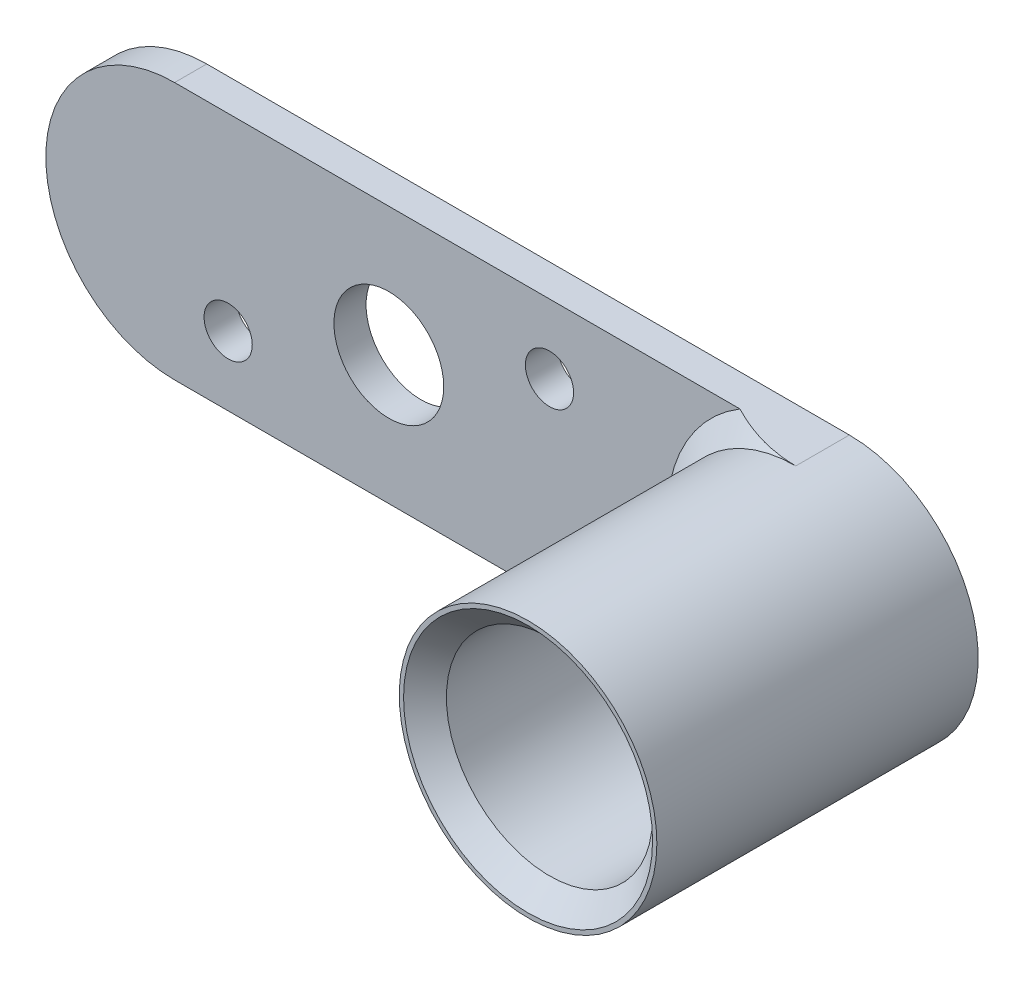
ISO-10303-21;
HEADER;
FILE_DESCRIPTION(('STEP AP214'),'2;1');
FILE_NAME('part.step','',(''),(''),'','','');
FILE_SCHEMA(('AUTOMOTIVE_DESIGN { 1 0 10303 214 1 1 1 1 }'));
ENDSEC;
DATA;
#1=APPLICATION_CONTEXT('core data for automotive mechanical design processes');
#2=APPLICATION_PROTOCOL_DEFINITION('international standard','automotive_design',2000,#1);
#3=PRODUCT_CONTEXT('',#1,'mechanical');
#4=PRODUCT('Part','Part','',(#3));
#5=PRODUCT_RELATED_PRODUCT_CATEGORY('part','',(#4));
#6=PRODUCT_DEFINITION_FORMATION('','',#4);
#7=PRODUCT_DEFINITION_CONTEXT('part definition',#1,'design');
#8=PRODUCT_DEFINITION('design','',#6,#7);
#9=PRODUCT_DEFINITION_SHAPE('','',#8);
#10=(LENGTH_UNIT() NAMED_UNIT(*) SI_UNIT(.MILLI.,.METRE.));
#11=(NAMED_UNIT(*) PLANE_ANGLE_UNIT() SI_UNIT($,.RADIAN.));
#12=(NAMED_UNIT(*) SI_UNIT($,.STERADIAN.) SOLID_ANGLE_UNIT());
#13=UNCERTAINTY_MEASURE_WITH_UNIT(LENGTH_MEASURE(1.E-05),#10,'distance_accuracy_value','');
#14=(GEOMETRIC_REPRESENTATION_CONTEXT(3) GLOBAL_UNCERTAINTY_ASSIGNED_CONTEXT((#13)) GLOBAL_UNIT_ASSIGNED_CONTEXT((#10,
#11,#12)) REPRESENTATION_CONTEXT('',''));
#15=CARTESIAN_POINT('',(0.,0.,0.));
#16=DIRECTION('',(0.,0.,1.));
#17=DIRECTION('',(1.,0.,0.));
#18=AXIS2_PLACEMENT_3D('',#15,#16,#17);
#19=CARTESIAN_POINT('',(0.,0.,3.));
#20=DIRECTION('',(0.,0.,1.));
#21=DIRECTION('',(1.,0.,0.));
#22=AXIS2_PLACEMENT_3D('',#19,#20,#21);
#23=PLANE('',#22);
#24=CARTESIAN_POINT('',(15.,5.56776436283002,3.));
#25=DIRECTION('',(0.,0.,1.));
#26=DIRECTION('',(1.,0.,0.));
#27=AXIS2_PLACEMENT_3D('',#24,#25,#26);
#28=CIRCLE('',#27,2.25000000000003);
#29=CARTESIAN_POINT('',(17.25,5.56776436283002,3.));
#30=VERTEX_POINT('',#29);
#31=EDGE_CURVE('E122',#30,#30,#28,.T.);
#32=ORIENTED_EDGE('',*,*,#31,.F.);
#33=EDGE_LOOP('',(#32));
#34=FACE_BOUND('',#33,.T.);
#35=CARTESIAN_POINT('',(-15.,-5.56776436283002,3.));
#36=DIRECTION('',(0.,0.,1.));
#37=DIRECTION('',(1.,0.,0.));
#38=AXIS2_PLACEMENT_3D('',#35,#36,#37);
#39=CIRCLE('',#38,2.25);
#40=CARTESIAN_POINT('',(-12.75,-5.56776436283002,3.));
#41=VERTEX_POINT('',#40);
#42=EDGE_CURVE('E116',#41,#41,#39,.T.);
#43=ORIENTED_EDGE('',*,*,#42,.F.);
#44=EDGE_LOOP('',(#43));
#45=FACE_BOUND('',#44,.T.);
#46=CARTESIAN_POINT('',(0.,0.,3.));
#47=DIRECTION('',(0.,0.,1.));
#48=DIRECTION('',(1.,0.,0.));
#49=AXIS2_PLACEMENT_3D('',#46,#47,#48);
#50=CIRCLE('',#49,5.12500000000001);
#51=CARTESIAN_POINT('',(5.12500000000001,0.,3.));
#52=VERTEX_POINT('',#51);
#53=EDGE_CURVE('E113',#52,#52,#50,.T.);
#54=ORIENTED_EDGE('',*,*,#53,.F.);
#55=EDGE_LOOP('',(#54));
#56=FACE_BOUND('',#55,.T.);
#57=DIRECTION('',(-1.,0.,0.));
#58=VECTOR('',#57,1.);
#59=CARTESIAN_POINT('',(0.,-12.025,3.));
#60=LINE('',#59,#58);
#61=CARTESIAN_POINT('',(32.7819670269526,-12.025,3.));
#62=VERTEX_POINT('',#61);
#63=CARTESIAN_POINT('',(-20.,-12.025,3.));
#64=VERTEX_POINT('',#63);
#65=EDGE_CURVE('E100',#62,#64,#60,.T.);
#66=ORIENTED_EDGE('',*,*,#65,.F.);
#67=CARTESIAN_POINT('',(40.,0.,3.));
#68=DIRECTION('',(0.,0.,1.));
#69=DIRECTION('',(1.,0.,0.));
#70=AXIS2_PLACEMENT_3D('',#67,#68,#69);
#71=CIRCLE('',#70,14.025);
#72=CARTESIAN_POINT('',(32.7819670269526,12.025,3.));
#73=VERTEX_POINT('',#72);
#74=EDGE_CURVE('E98',#62,#73,#71,.F.);
#75=ORIENTED_EDGE('',*,*,#74,.T.);
#76=DIRECTION('',(-1.,0.,0.));
#77=VECTOR('',#76,1.);
#78=CARTESIAN_POINT('',(0.,12.025,3.));
#79=LINE('',#78,#77);
#80=CARTESIAN_POINT('',(-20.,12.025,3.));
#81=VERTEX_POINT('',#80);
#82=EDGE_CURVE('E91',#73,#81,#79,.T.);
#83=ORIENTED_EDGE('',*,*,#82,.T.);
#84=CARTESIAN_POINT('',(-20.,0.,3.));
#85=DIRECTION('',(0.,0.,1.));
#86=DIRECTION('',(1.,0.,0.));
#87=AXIS2_PLACEMENT_3D('',#84,#85,#86);
#88=CIRCLE('',#87,12.025);
#89=EDGE_CURVE('E95',#81,#64,#88,.T.);
#90=ORIENTED_EDGE('',*,*,#89,.T.);
#91=EDGE_LOOP('',(#66,#75,#83,#90));
#92=FACE_BOUND('',#91,.T.);
#93=ADVANCED_FACE('F39',(#34,#45,#56,#92),#23,.T.);
#94=CARTESIAN_POINT('',(0.,-12.025,3.));
#95=DIRECTION('',(0.,-1.,0.));
#96=DIRECTION('',(1.,0.,0.));
#97=AXIS2_PLACEMENT_3D('',#94,#95,#96);
#98=PLANE('',#97);
#99=DIRECTION('',(-1.,0.,0.));
#100=VECTOR('',#99,1.);
#101=CARTESIAN_POINT('',(0.,-12.025,0.));
#102=LINE('',#101,#100);
#103=CARTESIAN_POINT('',(40.,-12.025,0.));
#104=VERTEX_POINT('',#103);
#105=CARTESIAN_POINT('',(-20.,-12.025,0.));
#106=VERTEX_POINT('',#105);
#107=EDGE_CURVE('E125',#104,#106,#102,.T.);
#108=ORIENTED_EDGE('',*,*,#107,.F.);
#109=DIRECTION('',(0.,0.,-1.));
#110=VECTOR('',#109,1.);
#111=CARTESIAN_POINT('',(40.,-12.025,3.));
#112=LINE('',#111,#110);
#113=CARTESIAN_POINT('',(40.,-12.025,4.99999999999999));
#114=VERTEX_POINT('',#113);
#115=EDGE_CURVE('E66',#114,#104,#112,.T.);
#116=ORIENTED_EDGE('',*,*,#115,.F.);
#117=CARTESIAN_POINT('',(40.,-12.025,4.99999999999999));
#118=CARTESIAN_POINT('',(39.8152938753838,-12.025,5.00002145719886));
#119=CARTESIAN_POINT('',(39.6305950831298,-12.025,4.99574489107242));
#120=CARTESIAN_POINT('',(39.2616141012268,-12.025,4.97875510483452));
#121=CARTESIAN_POINT('',(39.0773318503824,-12.025,4.96604321742305));
#122=CARTESIAN_POINT('',(38.7098557330805,-12.025,4.93237218124581));
#123=CARTESIAN_POINT('',(38.5266605106389,-12.025,4.91142780171937));
#124=CARTESIAN_POINT('',(38.1613618222524,-12.025,4.86159347220586));
#125=CARTESIAN_POINT('',(37.9792583873531,-12.025,4.83270329735901));
#126=CARTESIAN_POINT('',(37.440617184229,-12.025,4.73566506827948));
#127=CARTESIAN_POINT('',(37.0860046504119,-12.025,4.6565995096569));
#128=CARTESIAN_POINT('',(36.3835694261419,-12.025,4.47254652110243));
#129=CARTESIAN_POINT('',(36.0357490855055,-12.025,4.36755028585667));
#130=CARTESIAN_POINT('',(35.4427557226136,-12.025,4.16754467183974));
#131=CARTESIAN_POINT('',(35.1957820418478,-12.025,4.07779559187468));
#132=CARTESIAN_POINT('',(34.7058313826879,-12.025,3.88811133565684));
#133=CARTESIAN_POINT('',(34.4628537638486,-12.025,3.78817781050091));
#134=CARTESIAN_POINT('',(33.9779669176046,-12.025,3.57817328343921));
#135=CARTESIAN_POINT('',(33.73610334995,-12.025,3.46799747040257));
#136=CARTESIAN_POINT('',(33.2562152919079,-12.025,3.23968598141525));
#137=CARTESIAN_POINT('',(33.0181900426008,-12.025,3.12155190350975));
#138=CARTESIAN_POINT('',(32.7819670269526,-12.025,3.));
#139=B_SPLINE_CURVE_WITH_KNOTS('',3,(#117,#118,#119,#120,#121,#122,#123,#124,#125,#126,#127,
#128,#129,#130,#131,#132,#133,#134,#135,#136,#137,#138),.UNSPECIFIED.,.F.,.F.,(4,2,2,2,2,2,2,2,
2,2,4),(0.,0.554056716326873,1.10802591783132,1.66100579165074,2.21400131597727,
3.30273818889893,4.39184527518577,5.17993964553435,5.96790645307621,6.76508060843902,
7.56209516308595),.UNSPECIFIED.);
#140=EDGE_CURVE('E11',#114,#62,#139,.T.);
#141=ORIENTED_EDGE('',*,*,#140,.T.);
#142=ORIENTED_EDGE('',*,*,#65,.T.);
#143=DIRECTION('',(0.,0.,-1.));
#144=VECTOR('',#143,1.);
#145=CARTESIAN_POINT('',(-20.,-12.025,3.));
#146=LINE('',#145,#144);
#147=EDGE_CURVE('E110',#64,#106,#146,.T.);
#148=ORIENTED_EDGE('',*,*,#147,.T.);
#149=EDGE_LOOP('',(#108,#116,#141,#142,#148));
#150=FACE_BOUND('',#149,.T.);
#151=ADVANCED_FACE('F173',(#150),#98,.T.);
#152=CARTESIAN_POINT('',(40.,0.,3.));
#153=DIRECTION('',(0.,0.,-1.));
#154=DIRECTION('',(-1.,0.,0.));
#155=AXIS2_PLACEMENT_3D('',#152,#153,#154);
#156=CYLINDRICAL_SURFACE('',#155,12.025);
#157=DIRECTION('',(0.,0.,-1.));
#158=VECTOR('',#157,1.);
#159=CARTESIAN_POINT('',(40.,12.025,3.));
#160=LINE('',#159,#158);
#161=CARTESIAN_POINT('',(40.,12.025,4.99999999999999));
#162=VERTEX_POINT('',#161);
#163=CARTESIAN_POINT('',(40.,12.025,0.));
#164=VERTEX_POINT('',#163);
#165=EDGE_CURVE('E59',#162,#164,#160,.T.);
#166=ORIENTED_EDGE('',*,*,#165,.F.);
#167=CARTESIAN_POINT('',(40.,0.,4.99999999999999));
#168=DIRECTION('',(0.,0.,1.));
#169=DIRECTION('',(1.,0.,0.));
#170=AXIS2_PLACEMENT_3D('',#167,#168,#169);
#171=CIRCLE('',#170,12.025);
#172=EDGE_CURVE('E147',#162,#114,#171,.T.);
#173=ORIENTED_EDGE('',*,*,#172,.T.);
#174=ORIENTED_EDGE('',*,*,#115,.T.);
#175=CARTESIAN_POINT('',(40.,0.,0.));
#176=DIRECTION('',(0.,0.,1.));
#177=DIRECTION('',(1.,0.,0.));
#178=AXIS2_PLACEMENT_3D('',#175,#176,#177);
#179=CIRCLE('',#178,12.025);
#180=EDGE_CURVE('E128',#104,#164,#179,.T.);
#181=ORIENTED_EDGE('',*,*,#180,.T.);
#182=EDGE_LOOP('',(#166,#173,#174,#181));
#183=FACE_BOUND('',#182,.T.);
#184=CARTESIAN_POINT('',(40.,0.,30.));
#185=DIRECTION('',(0.,0.,1.));
#186=DIRECTION('',(1.,0.,0.));
#187=AXIS2_PLACEMENT_3D('',#184,#185,#186);
#188=CIRCLE('',#187,12.025);
#189=CARTESIAN_POINT('',(52.025,0.,30.));
#190=VERTEX_POINT('',#189);
#191=EDGE_CURVE('E129',#190,#190,#188,.T.);
#192=ORIENTED_EDGE('',*,*,#191,.F.);
#193=EDGE_LOOP('',(#192));
#194=FACE_BOUND('',#193,.T.);
#195=ADVANCED_FACE('F190',(#183,#194),#156,.T.);
#196=CARTESIAN_POINT('',(0.,12.025,3.));
#197=DIRECTION('',(0.,-1.,0.));
#198=DIRECTION('',(1.,0.,0.));
#199=AXIS2_PLACEMENT_3D('',#196,#197,#198);
#200=PLANE('',#199);
#201=DIRECTION('',(-1.,0.,0.));
#202=VECTOR('',#201,1.);
#203=CARTESIAN_POINT('',(0.,12.025,0.));
#204=LINE('',#203,#202);
#205=CARTESIAN_POINT('',(-20.,12.025,0.));
#206=VERTEX_POINT('',#205);
#207=EDGE_CURVE('E106',#164,#206,#204,.T.);
#208=ORIENTED_EDGE('',*,*,#207,.T.);
#209=DIRECTION('',(0.,0.,-1.));
#210=VECTOR('',#209,1.);
#211=CARTESIAN_POINT('',(-20.,12.025,3.));
#212=LINE('',#211,#210);
#213=EDGE_CURVE('E103',#81,#206,#212,.T.);
#214=ORIENTED_EDGE('',*,*,#213,.F.);
#215=ORIENTED_EDGE('',*,*,#82,.F.);
#216=CARTESIAN_POINT('',(32.7819670269526,12.025,3.));
#217=CARTESIAN_POINT('',(33.0308978481961,12.025,3.12808738890489));
#218=CARTESIAN_POINT('',(33.2818336842959,12.025,3.25238575603995));
#219=CARTESIAN_POINT('',(33.7880828534682,12.025,3.49212838351939));
#220=CARTESIAN_POINT('',(34.0433988161881,12.025,3.6075670798169));
#221=CARTESIAN_POINT('',(34.5602569041917,12.025,3.8289182872493));
#222=CARTESIAN_POINT('',(34.8218299789424,12.025,3.93475897367695));
#223=CARTESIAN_POINT('',(35.3495048604973,12.025,4.13437963115232));
#224=CARTESIAN_POINT('',(35.6156057720813,12.025,4.22816195564997));
#225=CARTESIAN_POINT('',(36.1440717188805,12.025,4.39930171353962));
#226=CARTESIAN_POINT('',(36.4063016062566,12.025,4.47707418933278));
#227=CARTESIAN_POINT('',(36.9346403796207,12.025,4.61805547185311));
#228=CARTESIAN_POINT('',(37.2007487448141,12.025,4.68126621508979));
#229=CARTESIAN_POINT('',(37.7355029297977,12.025,4.79142623409124));
#230=CARTESIAN_POINT('',(38.0041388667202,12.025,4.83842324618511));
#231=CARTESIAN_POINT('',(38.543813745957,12.025,4.91509282916424));
#232=CARTESIAN_POINT('',(38.8148516519752,12.025,4.94477253407907));
#233=CARTESIAN_POINT('',(39.1623403285746,12.025,4.97109763157001));
#234=CARTESIAN_POINT('',(39.2382081388808,12.025,4.97613284825757));
#235=CARTESIAN_POINT('',(39.3900308329409,12.025,4.98477774762961));
#236=CARTESIAN_POINT('',(39.4659857211923,12.025,4.98838735301735));
#237=CARTESIAN_POINT('',(39.6945672696438,12.025,4.99708929846968));
#238=CARTESIAN_POINT('',(39.8472798348681,12.025,5.00000681012417));
#239=CARTESIAN_POINT('',(40.,12.025,4.99999999999999));
#240=B_SPLINE_CURVE_WITH_KNOTS('',3,(#216,#217,#218,#219,#220,#221,#222,#223,#224,#225,#226,
#227,#228,#229,#230,#231,#232,#233,#234,#235,#236,#237,#238,#239),.UNSPECIFIED.,.F.,.F.,(4,2,2,
2,2,2,2,2,2,2,2,4),(0.,0.839895620520478,1.68031446753364,2.52657737715576,3.37267486875803,
4.19286160110225,5.01293919688102,5.8305812991882,6.64788632778993,6.8759824517636,
7.10409094142404,7.56220501019906),.UNSPECIFIED.);
#241=EDGE_CURVE('E52',#73,#162,#240,.T.);
#242=ORIENTED_EDGE('',*,*,#241,.T.);
#243=ORIENTED_EDGE('',*,*,#165,.T.);
#244=EDGE_LOOP('',(#208,#214,#215,#242,#243));
#245=FACE_BOUND('',#244,.T.);
#246=ADVANCED_FACE('F104',(#245),#200,.F.);
#247=CARTESIAN_POINT('',(15.,5.56776436283002,3.));
#248=DIRECTION('',(0.,0.,-1.));
#249=DIRECTION('',(-1.,0.,0.));
#250=AXIS2_PLACEMENT_3D('',#247,#248,#249);
#251=CYLINDRICAL_SURFACE('',#250,2.25000000000003);
#252=ORIENTED_EDGE('',*,*,#31,.T.);
#253=EDGE_LOOP('',(#252));
#254=FACE_BOUND('',#253,.T.);
#255=CARTESIAN_POINT('',(15.,5.56776436283002,0.));
#256=DIRECTION('',(0.,0.,1.));
#257=DIRECTION('',(1.,0.,0.));
#258=AXIS2_PLACEMENT_3D('',#255,#256,#257);
#259=CIRCLE('',#258,2.25000000000003);
#260=CARTESIAN_POINT('',(17.25,5.56776436283002,0.));
#261=VERTEX_POINT('',#260);
#262=EDGE_CURVE('E140',#261,#261,#259,.T.);
#263=ORIENTED_EDGE('',*,*,#262,.F.);
#264=EDGE_LOOP('',(#263));
#265=FACE_BOUND('',#264,.T.);
#266=ADVANCED_FACE('F203',(#254,#265),#251,.F.);
#267=CARTESIAN_POINT('',(-15.,-5.56776436283002,3.));
#268=DIRECTION('',(0.,0.,-1.));
#269=DIRECTION('',(-1.,0.,0.));
#270=AXIS2_PLACEMENT_3D('',#267,#268,#269);
#271=CYLINDRICAL_SURFACE('',#270,2.25);
#272=ORIENTED_EDGE('',*,*,#42,.T.);
#273=EDGE_LOOP('',(#272));
#274=FACE_BOUND('',#273,.T.);
#275=CARTESIAN_POINT('',(-15.,-5.56776436283002,0.));
#276=DIRECTION('',(0.,0.,1.));
#277=DIRECTION('',(1.,0.,0.));
#278=AXIS2_PLACEMENT_3D('',#275,#276,#277);
#279=CIRCLE('',#278,2.25);
#280=CARTESIAN_POINT('',(-12.75,-5.56776436283002,0.));
#281=VERTEX_POINT('',#280);
#282=EDGE_CURVE('E137',#281,#281,#279,.T.);
#283=ORIENTED_EDGE('',*,*,#282,.F.);
#284=EDGE_LOOP('',(#283));
#285=FACE_BOUND('',#284,.T.);
#286=ADVANCED_FACE('F206',(#274,#285),#271,.F.);
#287=CARTESIAN_POINT('',(0.,0.,3.));
#288=DIRECTION('',(0.,0.,-1.));
#289=DIRECTION('',(-1.,0.,0.));
#290=AXIS2_PLACEMENT_3D('',#287,#288,#289);
#291=CYLINDRICAL_SURFACE('',#290,5.12500000000001);
#292=ORIENTED_EDGE('',*,*,#53,.T.);
#293=EDGE_LOOP('',(#292));
#294=FACE_BOUND('',#293,.T.);
#295=CARTESIAN_POINT('',(0.,0.,0.));
#296=DIRECTION('',(0.,0.,1.));
#297=DIRECTION('',(1.,0.,0.));
#298=AXIS2_PLACEMENT_3D('',#295,#296,#297);
#299=CIRCLE('',#298,5.12500000000001);
#300=CARTESIAN_POINT('',(5.12500000000001,0.,0.));
#301=VERTEX_POINT('',#300);
#302=EDGE_CURVE('E134',#301,#301,#299,.T.);
#303=ORIENTED_EDGE('',*,*,#302,.F.);
#304=EDGE_LOOP('',(#303));
#305=FACE_BOUND('',#304,.T.);
#306=ADVANCED_FACE('F210',(#294,#305),#291,.F.);
#307=CARTESIAN_POINT('',(-20.,0.,3.));
#308=DIRECTION('',(0.,0.,-1.));
#309=DIRECTION('',(-1.,0.,0.));
#310=AXIS2_PLACEMENT_3D('',#307,#308,#309);
#311=CYLINDRICAL_SURFACE('',#310,12.025);
#312=CARTESIAN_POINT('',(-20.,0.,0.));
#313=DIRECTION('',(0.,0.,1.));
#314=DIRECTION('',(1.,0.,0.));
#315=AXIS2_PLACEMENT_3D('',#312,#313,#314);
#316=CIRCLE('',#315,12.025);
#317=EDGE_CURVE('E132',#206,#106,#316,.T.);
#318=ORIENTED_EDGE('',*,*,#317,.T.);
#319=ORIENTED_EDGE('',*,*,#147,.F.);
#320=ORIENTED_EDGE('',*,*,#89,.F.);
#321=ORIENTED_EDGE('',*,*,#213,.T.);
#322=EDGE_LOOP('',(#318,#319,#320,#321));
#323=FACE_BOUND('',#322,.T.);
#324=ADVANCED_FACE('F112',(#323),#311,.T.);
#325=CARTESIAN_POINT('',(40.,0.,3.));
#326=DIRECTION('',(0.,0.,-1.));
#327=DIRECTION('',(-1.,0.,0.));
#328=AXIS2_PLACEMENT_3D('',#325,#326,#327);
#329=CYLINDRICAL_SURFACE('',#328,9.625);
#330=CARTESIAN_POINT('',(40.,0.,28.));
#331=DIRECTION('',(0.,0.,1.));
#332=DIRECTION('',(1.,0.,0.));
#333=AXIS2_PLACEMENT_3D('',#330,#331,#332);
#334=CIRCLE('',#333,9.625);
#335=CARTESIAN_POINT('',(49.625,0.,28.));
#336=VERTEX_POINT('',#335);
#337=EDGE_CURVE('E152',#336,#336,#334,.T.);
#338=ORIENTED_EDGE('',*,*,#337,.T.);
#339=EDGE_LOOP('',(#338));
#340=FACE_BOUND('',#339,.T.);
#341=CARTESIAN_POINT('',(40.,0.,2.00000000000001));
#342=DIRECTION('',(0.,0.,1.));
#343=DIRECTION('',(1.,0.,0.));
#344=AXIS2_PLACEMENT_3D('',#341,#342,#343);
#345=CIRCLE('',#344,9.625);
#346=CARTESIAN_POINT('',(49.625,0.,2.00000000000001));
#347=VERTEX_POINT('',#346);
#348=EDGE_CURVE('E149',#347,#347,#345,.F.);
#349=ORIENTED_EDGE('',*,*,#348,.T.);
#350=EDGE_LOOP('',(#349));
#351=FACE_BOUND('',#350,.T.);
#352=ADVANCED_FACE('F198',(#340,#351),#329,.F.);
#353=CARTESIAN_POINT('',(0.,0.,0.));
#354=DIRECTION('',(0.,0.,1.));
#355=DIRECTION('',(1.,0.,0.));
#356=AXIS2_PLACEMENT_3D('',#353,#354,#355);
#357=PLANE('',#356);
#358=CARTESIAN_POINT('',(40.,0.,0.));
#359=DIRECTION('',(0.,0.,1.));
#360=DIRECTION('',(1.,0.,0.));
#361=AXIS2_PLACEMENT_3D('',#358,#359,#360);
#362=CIRCLE('',#361,11.625);
#363=CARTESIAN_POINT('',(51.625,0.,0.));
#364=VERTEX_POINT('',#363);
#365=EDGE_CURVE('E158',#364,#364,#362,.T.);
#366=ORIENTED_EDGE('',*,*,#365,.T.);
#367=EDGE_LOOP('',(#366));
#368=FACE_BOUND('',#367,.T.);
#369=ORIENTED_EDGE('',*,*,#180,.F.);
#370=ORIENTED_EDGE('',*,*,#107,.T.);
#371=ORIENTED_EDGE('',*,*,#317,.F.);
#372=ORIENTED_EDGE('',*,*,#207,.F.);
#373=EDGE_LOOP('',(#369,#370,#371,#372));
#374=FACE_BOUND('',#373,.T.);
#375=ORIENTED_EDGE('',*,*,#262,.T.);
#376=EDGE_LOOP('',(#375));
#377=FACE_BOUND('',#376,.T.);
#378=ORIENTED_EDGE('',*,*,#282,.T.);
#379=EDGE_LOOP('',(#378));
#380=FACE_BOUND('',#379,.T.);
#381=ORIENTED_EDGE('',*,*,#302,.T.);
#382=EDGE_LOOP('',(#381));
#383=FACE_BOUND('',#382,.T.);
#384=ADVANCED_FACE('F195',(#368,#374,#377,#380,#383),#357,.F.);
#385=CARTESIAN_POINT('',(0.,0.,30.));
#386=DIRECTION('',(0.,0.,1.));
#387=DIRECTION('',(1.,0.,0.));
#388=AXIS2_PLACEMENT_3D('',#385,#386,#387);
#389=PLANE('',#388);
#390=CARTESIAN_POINT('',(40.,0.,30.));
#391=DIRECTION('',(0.,0.,1.));
#392=DIRECTION('',(1.,0.,0.));
#393=AXIS2_PLACEMENT_3D('',#390,#391,#392);
#394=CIRCLE('',#393,11.625);
#395=CARTESIAN_POINT('',(51.625,0.,30.));
#396=VERTEX_POINT('',#395);
#397=EDGE_CURVE('E155',#396,#396,#394,.F.);
#398=ORIENTED_EDGE('',*,*,#397,.T.);
#399=EDGE_LOOP('',(#398));
#400=FACE_BOUND('',#399,.T.);
#401=ORIENTED_EDGE('',*,*,#191,.T.);
#402=EDGE_LOOP('',(#401));
#403=FACE_BOUND('',#402,.T.);
#404=ADVANCED_FACE('F171',(#400,#403),#389,.T.);
#405=CARTESIAN_POINT('',(40.,0.,3.));
#406=DIRECTION('',(0.,0.,-1.));
#407=DIRECTION('',(-1.,0.,0.));
#408=AXIS2_PLACEMENT_3D('',#405,#406,#407);
#409=CONICAL_SURFACE('',#408,14.025,0.785398163397452);
#410=ORIENTED_EDGE('',*,*,#140,.F.);
#411=ORIENTED_EDGE('',*,*,#172,.F.);
#412=ORIENTED_EDGE('',*,*,#241,.F.);
#413=ORIENTED_EDGE('',*,*,#74,.F.);
#414=EDGE_LOOP('',(#410,#411,#412,#413));
#415=FACE_BOUND('',#414,.T.);
#416=ADVANCED_FACE('F167',(#415),#409,.T.);
#417=CARTESIAN_POINT('',(40.,0.,28.));
#418=DIRECTION('',(0.,0.,1.));
#419=DIRECTION('',(1.,0.,0.));
#420=AXIS2_PLACEMENT_3D('',#417,#418,#419);
#421=CONICAL_SURFACE('',#420,9.625,0.78539816339745);
#422=ORIENTED_EDGE('',*,*,#397,.F.);
#423=EDGE_LOOP('',(#422));
#424=FACE_BOUND('',#423,.T.);
#425=ORIENTED_EDGE('',*,*,#337,.F.);
#426=EDGE_LOOP('',(#425));
#427=FACE_BOUND('',#426,.T.);
#428=ADVANCED_FACE('F170',(#424,#427),#421,.F.);
#429=CARTESIAN_POINT('',(40.,0.,0.));
#430=DIRECTION('',(0.,0.,-1.));
#431=DIRECTION('',(-1.,0.,0.));
#432=AXIS2_PLACEMENT_3D('',#429,#430,#431);
#433=CONICAL_SURFACE('',#432,11.625,0.785398163397444);
#434=ORIENTED_EDGE('',*,*,#348,.F.);
#435=EDGE_LOOP('',(#434));
#436=FACE_BOUND('',#435,.T.);
#437=ORIENTED_EDGE('',*,*,#365,.F.);
#438=EDGE_LOOP('',(#437));
#439=FACE_BOUND('',#438,.T.);
#440=ADVANCED_FACE('F41',(#436,#439),#433,.F.);
#441=CLOSED_SHELL('',(#93,#151,#195,#246,#266,#286,#306,#324,#352,#384,#404,#416,#428,#440));
#442=MANIFOLD_SOLID_BREP('B2',#441);
#443=ADVANCED_BREP_SHAPE_REPRESENTATION('',(#18,#442),#14);
#444=SHAPE_DEFINITION_REPRESENTATION(#9,#443);
ENDSEC;
END-ISO-10303-21;
